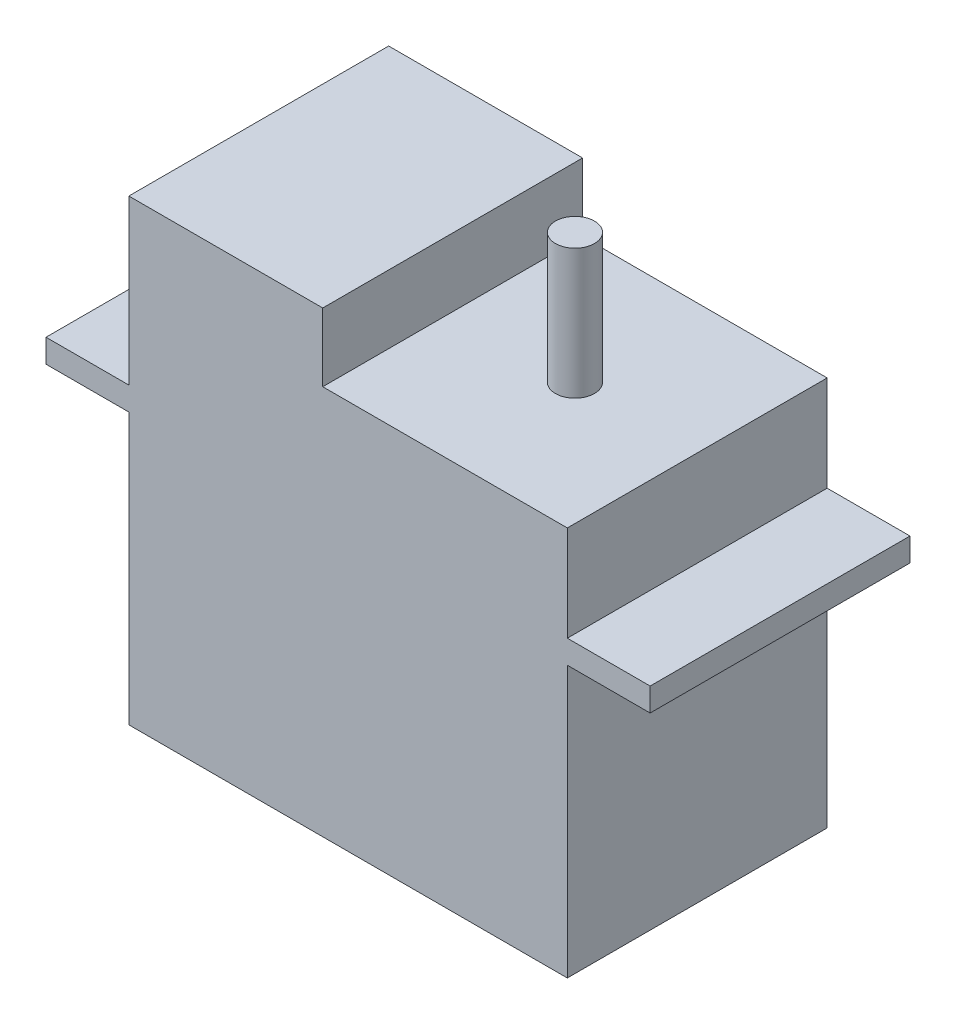
ISO-10303-21;
HEADER;
FILE_DESCRIPTION(('STEP AP214'),'2;1');
FILE_NAME('part.step','',(''),(''),'','','');
FILE_SCHEMA(('AUTOMOTIVE_DESIGN { 1 0 10303 214 1 1 1 1 }'));
ENDSEC;
DATA;
#1=APPLICATION_CONTEXT('core data for automotive mechanical design processes');
#2=APPLICATION_PROTOCOL_DEFINITION('international standard','automotive_design',2000,#1);
#3=PRODUCT_CONTEXT('',#1,'mechanical');
#4=PRODUCT('Part','Part','',(#3));
#5=PRODUCT_RELATED_PRODUCT_CATEGORY('part','',(#4));
#6=PRODUCT_DEFINITION_FORMATION('','',#4);
#7=PRODUCT_DEFINITION_CONTEXT('part definition',#1,'design');
#8=PRODUCT_DEFINITION('design','',#6,#7);
#9=PRODUCT_DEFINITION_SHAPE('','',#8);
#10=(LENGTH_UNIT() NAMED_UNIT(*) SI_UNIT(.MILLI.,.METRE.));
#11=(NAMED_UNIT(*) PLANE_ANGLE_UNIT() SI_UNIT($,.RADIAN.));
#12=(NAMED_UNIT(*) SI_UNIT($,.STERADIAN.) SOLID_ANGLE_UNIT());
#13=UNCERTAINTY_MEASURE_WITH_UNIT(LENGTH_MEASURE(1.E-05),#10,'distance_accuracy_value','');
#14=(GEOMETRIC_REPRESENTATION_CONTEXT(3) GLOBAL_UNCERTAINTY_ASSIGNED_CONTEXT((#13)) GLOBAL_UNIT_ASSIGNED_CONTEXT((#10,
#11,#12)) REPRESENTATION_CONTEXT('',''));
#15=CARTESIAN_POINT('',(0.,0.,0.));
#16=DIRECTION('',(0.,0.,1.));
#17=DIRECTION('',(1.,0.,0.));
#18=AXIS2_PLACEMENT_3D('',#15,#16,#17);
#19=CARTESIAN_POINT('',(33.75,30.,-10.));
#20=DIRECTION('',(-1.,0.,0.));
#21=DIRECTION('',(0.,-1.,0.));
#22=AXIS2_PLACEMENT_3D('',#19,#20,#21);
#23=PLANE('',#22);
#24=DIRECTION('',(0.,0.,1.));
#25=VECTOR('',#24,1.);
#26=CARTESIAN_POINT('',(33.75,30.,-10.));
#27=LINE('',#26,#25);
#28=CARTESIAN_POINT('',(33.75,30.,-10.));
#29=VERTEX_POINT('',#28);
#30=CARTESIAN_POINT('',(33.75,30.,10.));
#31=VERTEX_POINT('',#30);
#32=EDGE_CURVE('E46',#29,#31,#27,.T.);
#33=ORIENTED_EDGE('',*,*,#32,.T.);
#34=DIRECTION('',(0.,-1.,0.));
#35=VECTOR('',#34,1.);
#36=CARTESIAN_POINT('',(33.75,30.,10.));
#37=LINE('',#36,#35);
#38=CARTESIAN_POINT('',(33.75,22.65,10.));
#39=VERTEX_POINT('',#38);
#40=EDGE_CURVE('E146',#31,#39,#37,.T.);
#41=ORIENTED_EDGE('',*,*,#40,.T.);
#42=DIRECTION('',(0.,0.,1.));
#43=VECTOR('',#42,1.);
#44=CARTESIAN_POINT('',(33.75,22.65,-10.));
#45=LINE('',#44,#43);
#46=CARTESIAN_POINT('',(33.75,22.65,-10.));
#47=VERTEX_POINT('',#46);
#48=EDGE_CURVE('E11',#47,#39,#45,.T.);
#49=ORIENTED_EDGE('',*,*,#48,.F.);
#50=DIRECTION('',(0.,-1.,0.));
#51=VECTOR('',#50,1.);
#52=CARTESIAN_POINT('',(33.75,30.,-10.));
#53=LINE('',#52,#51);
#54=EDGE_CURVE('E191',#29,#47,#53,.T.);
#55=ORIENTED_EDGE('',*,*,#54,.F.);
#56=EDGE_LOOP('',(#33,#41,#49,#55));
#57=FACE_BOUND('',#56,.T.);
#58=ADVANCED_FACE('F32',(#57),#23,.F.);
#59=CARTESIAN_POINT('',(33.75,22.65,-10.));
#60=DIRECTION('',(0.,-1.,0.));
#61=DIRECTION('',(0.,0.,-1.));
#62=AXIS2_PLACEMENT_3D('',#59,#60,#61);
#63=PLANE('',#62);
#64=ORIENTED_EDGE('',*,*,#48,.T.);
#65=DIRECTION('',(1.,0.,0.));
#66=VECTOR('',#65,1.);
#67=CARTESIAN_POINT('',(33.75,22.65,10.));
#68=LINE('',#67,#66);
#69=CARTESIAN_POINT('',(40.125,22.65,10.));
#70=VERTEX_POINT('',#69);
#71=EDGE_CURVE('E136',#39,#70,#68,.T.);
#72=ORIENTED_EDGE('',*,*,#71,.T.);
#73=DIRECTION('',(0.,0.,1.));
#74=VECTOR('',#73,1.);
#75=CARTESIAN_POINT('',(40.125,22.65,-10.));
#76=LINE('',#75,#74);
#77=CARTESIAN_POINT('',(40.125,22.65,-10.));
#78=VERTEX_POINT('',#77);
#79=EDGE_CURVE('E39',#78,#70,#76,.T.);
#80=ORIENTED_EDGE('',*,*,#79,.F.);
#81=DIRECTION('',(1.,0.,0.));
#82=VECTOR('',#81,1.);
#83=CARTESIAN_POINT('',(33.75,22.65,-10.));
#84=LINE('',#83,#82);
#85=EDGE_CURVE('E137',#47,#78,#84,.T.);
#86=ORIENTED_EDGE('',*,*,#85,.F.);
#87=EDGE_LOOP('',(#64,#72,#80,#86));
#88=FACE_BOUND('',#87,.T.);
#89=ADVANCED_FACE('F134',(#88),#63,.F.);
#90=CARTESIAN_POINT('',(40.125,22.65,-10.));
#91=DIRECTION('',(-1.,0.,0.));
#92=DIRECTION('',(0.,0.,1.));
#93=AXIS2_PLACEMENT_3D('',#90,#91,#92);
#94=PLANE('',#93);
#95=ORIENTED_EDGE('',*,*,#79,.T.);
#96=DIRECTION('',(0.,-1.,0.));
#97=VECTOR('',#96,1.);
#98=CARTESIAN_POINT('',(40.125,22.65,10.));
#99=LINE('',#98,#97);
#100=CARTESIAN_POINT('',(40.125,20.85,10.));
#101=VERTEX_POINT('',#100);
#102=EDGE_CURVE('E149',#70,#101,#99,.T.);
#103=ORIENTED_EDGE('',*,*,#102,.T.);
#104=DIRECTION('',(0.,0.,1.));
#105=VECTOR('',#104,1.);
#106=CARTESIAN_POINT('',(40.125,20.85,-10.));
#107=LINE('',#106,#105);
#108=CARTESIAN_POINT('',(40.125,20.85,-10.));
#109=VERTEX_POINT('',#108);
#110=EDGE_CURVE('E242',#109,#101,#107,.T.);
#111=ORIENTED_EDGE('',*,*,#110,.F.);
#112=DIRECTION('',(0.,-1.,0.));
#113=VECTOR('',#112,1.);
#114=CARTESIAN_POINT('',(40.125,22.65,-10.));
#115=LINE('',#114,#113);
#116=EDGE_CURVE('E194',#78,#109,#115,.T.);
#117=ORIENTED_EDGE('',*,*,#116,.F.);
#118=EDGE_LOOP('',(#95,#103,#111,#117));
#119=FACE_BOUND('',#118,.T.);
#120=ADVANCED_FACE('F245',(#119),#94,.F.);
#121=CARTESIAN_POINT('',(40.125,20.85,-10.));
#122=DIRECTION('',(0.,1.,0.));
#123=DIRECTION('',(-1.,0.,0.));
#124=AXIS2_PLACEMENT_3D('',#121,#122,#123);
#125=PLANE('',#124);
#126=ORIENTED_EDGE('',*,*,#110,.T.);
#127=DIRECTION('',(-1.,0.,0.));
#128=VECTOR('',#127,1.);
#129=CARTESIAN_POINT('',(40.125,20.85,10.));
#130=LINE('',#129,#128);
#131=CARTESIAN_POINT('',(33.75,20.85,10.));
#132=VERTEX_POINT('',#131);
#133=EDGE_CURVE('E159',#101,#132,#130,.T.);
#134=ORIENTED_EDGE('',*,*,#133,.T.);
#135=DIRECTION('',(0.,0.,1.));
#136=VECTOR('',#135,1.);
#137=CARTESIAN_POINT('',(33.75,20.85,-10.));
#138=LINE('',#137,#136);
#139=CARTESIAN_POINT('',(33.75,20.85,-10.));
#140=VERTEX_POINT('',#139);
#141=EDGE_CURVE('E240',#140,#132,#138,.T.);
#142=ORIENTED_EDGE('',*,*,#141,.F.);
#143=DIRECTION('',(-1.,0.,0.));
#144=VECTOR('',#143,1.);
#145=CARTESIAN_POINT('',(40.125,20.85,-10.));
#146=LINE('',#145,#144);
#147=EDGE_CURVE('E196',#109,#140,#146,.T.);
#148=ORIENTED_EDGE('',*,*,#147,.F.);
#149=EDGE_LOOP('',(#126,#134,#142,#148));
#150=FACE_BOUND('',#149,.T.);
#151=ADVANCED_FACE('F291',(#150),#125,.F.);
#152=CARTESIAN_POINT('',(33.75,20.85,-10.));
#153=DIRECTION('',(-1.,0.,0.));
#154=DIRECTION('',(0.,-1.,0.));
#155=AXIS2_PLACEMENT_3D('',#152,#153,#154);
#156=PLANE('',#155);
#157=ORIENTED_EDGE('',*,*,#141,.T.);
#158=DIRECTION('',(0.,-1.,0.));
#159=VECTOR('',#158,1.);
#160=CARTESIAN_POINT('',(33.75,20.85,10.));
#161=LINE('',#160,#159);
#162=CARTESIAN_POINT('',(33.75,0.,10.));
#163=VERTEX_POINT('',#162);
#164=EDGE_CURVE('E162',#132,#163,#161,.T.);
#165=ORIENTED_EDGE('',*,*,#164,.T.);
#166=DIRECTION('',(0.,0.,1.));
#167=VECTOR('',#166,1.);
#168=CARTESIAN_POINT('',(33.75,0.,-10.));
#169=LINE('',#168,#167);
#170=CARTESIAN_POINT('',(33.75,0.,-10.));
#171=VERTEX_POINT('',#170);
#172=EDGE_CURVE('E238',#171,#163,#169,.T.);
#173=ORIENTED_EDGE('',*,*,#172,.F.);
#174=DIRECTION('',(0.,-1.,0.));
#175=VECTOR('',#174,1.);
#176=CARTESIAN_POINT('',(33.75,20.85,-10.));
#177=LINE('',#176,#175);
#178=EDGE_CURVE('E198',#140,#171,#177,.T.);
#179=ORIENTED_EDGE('',*,*,#178,.F.);
#180=EDGE_LOOP('',(#157,#165,#173,#179));
#181=FACE_BOUND('',#180,.T.);
#182=ADVANCED_FACE('F289',(#181),#156,.F.);
#183=CARTESIAN_POINT('',(0.,0.,-10.));
#184=DIRECTION('',(0.,-1.,0.));
#185=DIRECTION('',(0.,0.,-1.));
#186=AXIS2_PLACEMENT_3D('',#183,#184,#185);
#187=PLANE('',#186);
#188=ORIENTED_EDGE('',*,*,#172,.T.);
#189=DIRECTION('',(1.,0.,0.));
#190=VECTOR('',#189,1.);
#191=CARTESIAN_POINT('',(0.,0.,10.));
#192=LINE('',#191,#190);
#193=CARTESIAN_POINT('',(0.,0.,10.));
#194=VERTEX_POINT('',#193);
#195=EDGE_CURVE('E165',#194,#163,#192,.T.);
#196=ORIENTED_EDGE('',*,*,#195,.F.);
#197=DIRECTION('',(0.,0.,1.));
#198=VECTOR('',#197,1.);
#199=CARTESIAN_POINT('',(0.,0.,-10.));
#200=LINE('',#199,#198);
#201=CARTESIAN_POINT('',(0.,0.,-10.));
#202=VERTEX_POINT('',#201);
#203=EDGE_CURVE('E236',#202,#194,#200,.T.);
#204=ORIENTED_EDGE('',*,*,#203,.F.);
#205=DIRECTION('',(1.,0.,0.));
#206=VECTOR('',#205,1.);
#207=CARTESIAN_POINT('',(0.,0.,-10.));
#208=LINE('',#207,#206);
#209=EDGE_CURVE('E200',#202,#171,#208,.T.);
#210=ORIENTED_EDGE('',*,*,#209,.T.);
#211=EDGE_LOOP('',(#188,#196,#204,#210));
#212=FACE_BOUND('',#211,.T.);
#213=ADVANCED_FACE('F284',(#212),#187,.T.);
#214=CARTESIAN_POINT('',(0.,20.85,-10.));
#215=DIRECTION('',(-1.,0.,0.));
#216=DIRECTION('',(0.,-1.,0.));
#217=AXIS2_PLACEMENT_3D('',#214,#215,#216);
#218=PLANE('',#217);
#219=ORIENTED_EDGE('',*,*,#203,.T.);
#220=DIRECTION('',(0.,-1.,0.));
#221=VECTOR('',#220,1.);
#222=CARTESIAN_POINT('',(0.,20.85,10.));
#223=LINE('',#222,#221);
#224=CARTESIAN_POINT('',(0.,20.85,10.));
#225=VERTEX_POINT('',#224);
#226=EDGE_CURVE('E168',#225,#194,#223,.T.);
#227=ORIENTED_EDGE('',*,*,#226,.F.);
#228=DIRECTION('',(0.,0.,1.));
#229=VECTOR('',#228,1.);
#230=CARTESIAN_POINT('',(0.,20.85,-10.));
#231=LINE('',#230,#229);
#232=CARTESIAN_POINT('',(0.,20.85,-10.));
#233=VERTEX_POINT('',#232);
#234=EDGE_CURVE('E234',#233,#225,#231,.T.);
#235=ORIENTED_EDGE('',*,*,#234,.F.);
#236=DIRECTION('',(0.,-1.,0.));
#237=VECTOR('',#236,1.);
#238=CARTESIAN_POINT('',(0.,20.85,-10.));
#239=LINE('',#238,#237);
#240=EDGE_CURVE('E203',#233,#202,#239,.T.);
#241=ORIENTED_EDGE('',*,*,#240,.T.);
#242=EDGE_LOOP('',(#219,#227,#235,#241));
#243=FACE_BOUND('',#242,.T.);
#244=ADVANCED_FACE('F280',(#243),#218,.T.);
#245=CARTESIAN_POINT('',(0.,20.85,-10.));
#246=DIRECTION('',(0.,1.,0.));
#247=DIRECTION('',(-1.,0.,0.));
#248=AXIS2_PLACEMENT_3D('',#245,#246,#247);
#249=PLANE('',#248);
#250=ORIENTED_EDGE('',*,*,#234,.T.);
#251=DIRECTION('',(-1.,0.,0.));
#252=VECTOR('',#251,1.);
#253=CARTESIAN_POINT('',(0.,20.85,10.));
#254=LINE('',#253,#252);
#255=CARTESIAN_POINT('',(-6.375,20.85,10.));
#256=VERTEX_POINT('',#255);
#257=EDGE_CURVE('E171',#225,#256,#254,.T.);
#258=ORIENTED_EDGE('',*,*,#257,.T.);
#259=DIRECTION('',(0.,0.,1.));
#260=VECTOR('',#259,1.);
#261=CARTESIAN_POINT('',(-6.375,20.85,-10.));
#262=LINE('',#261,#260);
#263=CARTESIAN_POINT('',(-6.375,20.85,-10.));
#264=VERTEX_POINT('',#263);
#265=EDGE_CURVE('E232',#264,#256,#262,.T.);
#266=ORIENTED_EDGE('',*,*,#265,.F.);
#267=DIRECTION('',(-1.,0.,0.));
#268=VECTOR('',#267,1.);
#269=CARTESIAN_POINT('',(0.,20.85,-10.));
#270=LINE('',#269,#268);
#271=EDGE_CURVE('E206',#233,#264,#270,.T.);
#272=ORIENTED_EDGE('',*,*,#271,.F.);
#273=EDGE_LOOP('',(#250,#258,#266,#272));
#274=FACE_BOUND('',#273,.T.);
#275=ADVANCED_FACE('F275',(#274),#249,.F.);
#276=CARTESIAN_POINT('',(-6.375,20.85,-10.));
#277=DIRECTION('',(1.,0.,0.));
#278=DIRECTION('',(0.,1.,0.));
#279=AXIS2_PLACEMENT_3D('',#276,#277,#278);
#280=PLANE('',#279);
#281=ORIENTED_EDGE('',*,*,#265,.T.);
#282=DIRECTION('',(0.,1.,0.));
#283=VECTOR('',#282,1.);
#284=CARTESIAN_POINT('',(-6.375,20.85,10.));
#285=LINE('',#284,#283);
#286=CARTESIAN_POINT('',(-6.375,22.65,10.));
#287=VERTEX_POINT('',#286);
#288=EDGE_CURVE('E174',#256,#287,#285,.T.);
#289=ORIENTED_EDGE('',*,*,#288,.T.);
#290=DIRECTION('',(0.,0.,1.));
#291=VECTOR('',#290,1.);
#292=CARTESIAN_POINT('',(-6.375,22.65,-10.));
#293=LINE('',#292,#291);
#294=CARTESIAN_POINT('',(-6.375,22.65,-10.));
#295=VERTEX_POINT('',#294);
#296=EDGE_CURVE('E230',#295,#287,#293,.T.);
#297=ORIENTED_EDGE('',*,*,#296,.F.);
#298=DIRECTION('',(0.,1.,0.));
#299=VECTOR('',#298,1.);
#300=CARTESIAN_POINT('',(-6.375,20.85,-10.));
#301=LINE('',#300,#299);
#302=EDGE_CURVE('E208',#264,#295,#301,.T.);
#303=ORIENTED_EDGE('',*,*,#302,.F.);
#304=EDGE_LOOP('',(#281,#289,#297,#303));
#305=FACE_BOUND('',#304,.T.);
#306=ADVANCED_FACE('F271',(#305),#280,.F.);
#307=CARTESIAN_POINT('',(-6.375,22.65,-10.));
#308=DIRECTION('',(0.,-1.,0.));
#309=DIRECTION('',(0.,0.,-1.));
#310=AXIS2_PLACEMENT_3D('',#307,#308,#309);
#311=PLANE('',#310);
#312=ORIENTED_EDGE('',*,*,#296,.T.);
#313=DIRECTION('',(1.,0.,0.));
#314=VECTOR('',#313,1.);
#315=CARTESIAN_POINT('',(-6.375,22.65,10.));
#316=LINE('',#315,#314);
#317=CARTESIAN_POINT('',(0.,22.65,10.));
#318=VERTEX_POINT('',#317);
#319=EDGE_CURVE('E177',#287,#318,#316,.T.);
#320=ORIENTED_EDGE('',*,*,#319,.T.);
#321=DIRECTION('',(0.,0.,1.));
#322=VECTOR('',#321,1.);
#323=CARTESIAN_POINT('',(0.,22.65,-10.));
#324=LINE('',#323,#322);
#325=CARTESIAN_POINT('',(0.,22.65,-10.));
#326=VERTEX_POINT('',#325);
#327=EDGE_CURVE('E228',#326,#318,#324,.T.);
#328=ORIENTED_EDGE('',*,*,#327,.F.);
#329=DIRECTION('',(1.,0.,0.));
#330=VECTOR('',#329,1.);
#331=CARTESIAN_POINT('',(-6.375,22.65,-10.));
#332=LINE('',#331,#330);
#333=EDGE_CURVE('E210',#295,#326,#332,.T.);
#334=ORIENTED_EDGE('',*,*,#333,.F.);
#335=EDGE_LOOP('',(#312,#320,#328,#334));
#336=FACE_BOUND('',#335,.T.);
#337=ADVANCED_FACE('F267',(#336),#311,.F.);
#338=CARTESIAN_POINT('',(0.,35.25,-10.));
#339=DIRECTION('',(-1.,0.,0.));
#340=DIRECTION('',(0.,-1.,0.));
#341=AXIS2_PLACEMENT_3D('',#338,#339,#340);
#342=PLANE('',#341);
#343=ORIENTED_EDGE('',*,*,#327,.T.);
#344=DIRECTION('',(0.,-1.,0.));
#345=VECTOR('',#344,1.);
#346=CARTESIAN_POINT('',(0.,35.25,10.));
#347=LINE('',#346,#345);
#348=CARTESIAN_POINT('',(0.,35.25,10.));
#349=VERTEX_POINT('',#348);
#350=EDGE_CURVE('E180',#349,#318,#347,.T.);
#351=ORIENTED_EDGE('',*,*,#350,.F.);
#352=DIRECTION('',(0.,0.,1.));
#353=VECTOR('',#352,1.);
#354=CARTESIAN_POINT('',(0.,35.25,-10.));
#355=LINE('',#354,#353);
#356=CARTESIAN_POINT('',(0.,35.25,-10.));
#357=VERTEX_POINT('',#356);
#358=EDGE_CURVE('E226',#357,#349,#355,.T.);
#359=ORIENTED_EDGE('',*,*,#358,.F.);
#360=DIRECTION('',(0.,-1.,0.));
#361=VECTOR('',#360,1.);
#362=CARTESIAN_POINT('',(0.,35.25,-10.));
#363=LINE('',#362,#361);
#364=EDGE_CURVE('E212',#357,#326,#363,.T.);
#365=ORIENTED_EDGE('',*,*,#364,.T.);
#366=EDGE_LOOP('',(#343,#351,#359,#365));
#367=FACE_BOUND('',#366,.T.);
#368=ADVANCED_FACE('F262',(#367),#342,.T.);
#369=CARTESIAN_POINT('',(14.925,35.25,-10.));
#370=DIRECTION('',(0.,1.,0.));
#371=DIRECTION('',(-1.,0.,0.));
#372=AXIS2_PLACEMENT_3D('',#369,#370,#371);
#373=PLANE('',#372);
#374=ORIENTED_EDGE('',*,*,#358,.T.);
#375=DIRECTION('',(-1.,0.,0.));
#376=VECTOR('',#375,1.);
#377=CARTESIAN_POINT('',(14.925,35.25,10.));
#378=LINE('',#377,#376);
#379=CARTESIAN_POINT('',(14.925,35.25,10.));
#380=VERTEX_POINT('',#379);
#381=EDGE_CURVE('E183',#380,#349,#378,.T.);
#382=ORIENTED_EDGE('',*,*,#381,.F.);
#383=DIRECTION('',(0.,0.,1.));
#384=VECTOR('',#383,1.);
#385=CARTESIAN_POINT('',(14.925,35.25,-10.));
#386=LINE('',#385,#384);
#387=CARTESIAN_POINT('',(14.925,35.25,-10.));
#388=VERTEX_POINT('',#387);
#389=EDGE_CURVE('E224',#388,#380,#386,.T.);
#390=ORIENTED_EDGE('',*,*,#389,.F.);
#391=DIRECTION('',(-1.,0.,0.));
#392=VECTOR('',#391,1.);
#393=CARTESIAN_POINT('',(14.925,35.25,-10.));
#394=LINE('',#393,#392);
#395=EDGE_CURVE('E215',#388,#357,#394,.T.);
#396=ORIENTED_EDGE('',*,*,#395,.T.);
#397=EDGE_LOOP('',(#374,#382,#390,#396));
#398=FACE_BOUND('',#397,.T.);
#399=ADVANCED_FACE('F257',(#398),#373,.T.);
#400=CARTESIAN_POINT('',(14.925,30.,-10.));
#401=DIRECTION('',(1.,0.,0.));
#402=DIRECTION('',(0.,1.,0.));
#403=AXIS2_PLACEMENT_3D('',#400,#401,#402);
#404=PLANE('',#403);
#405=ORIENTED_EDGE('',*,*,#389,.T.);
#406=DIRECTION('',(0.,1.,0.));
#407=VECTOR('',#406,1.);
#408=CARTESIAN_POINT('',(14.925,30.,10.));
#409=LINE('',#408,#407);
#410=CARTESIAN_POINT('',(14.925,30.,10.));
#411=VERTEX_POINT('',#410);
#412=EDGE_CURVE('E186',#411,#380,#409,.T.);
#413=ORIENTED_EDGE('',*,*,#412,.F.);
#414=DIRECTION('',(0.,0.,1.));
#415=VECTOR('',#414,1.);
#416=CARTESIAN_POINT('',(14.925,30.,-10.));
#417=LINE('',#416,#415);
#418=CARTESIAN_POINT('',(14.925,30.,-10.));
#419=VERTEX_POINT('',#418);
#420=EDGE_CURVE('E54',#419,#411,#417,.T.);
#421=ORIENTED_EDGE('',*,*,#420,.F.);
#422=DIRECTION('',(0.,1.,0.));
#423=VECTOR('',#422,1.);
#424=CARTESIAN_POINT('',(14.925,30.,-10.));
#425=LINE('',#424,#423);
#426=EDGE_CURVE('E218',#419,#388,#425,.T.);
#427=ORIENTED_EDGE('',*,*,#426,.T.);
#428=EDGE_LOOP('',(#405,#413,#421,#427));
#429=FACE_BOUND('',#428,.T.);
#430=ADVANCED_FACE('F255',(#429),#404,.T.);
#431=CARTESIAN_POINT('',(33.75,30.,-10.));
#432=DIRECTION('',(0.,1.,0.));
#433=DIRECTION('',(-1.,0.,0.));
#434=AXIS2_PLACEMENT_3D('',#431,#432,#433);
#435=PLANE('',#434);
#436=CARTESIAN_POINT('',(24.3375,30.,0.));
#437=DIRECTION('',(0.,1.,0.));
#438=DIRECTION('',(0.,0.,1.));
#439=AXIS2_PLACEMENT_3D('',#436,#437,#438);
#440=CIRCLE('',#439,1.5);
#441=CARTESIAN_POINT('',(24.3375,30.,1.5));
#442=VERTEX_POINT('',#441);
#443=EDGE_CURVE('E154',#442,#442,#440,.T.);
#444=ORIENTED_EDGE('',*,*,#443,.F.);
#445=EDGE_LOOP('',(#444));
#446=FACE_BOUND('',#445,.T.);
#447=ORIENTED_EDGE('',*,*,#420,.T.);
#448=DIRECTION('',(-1.,0.,0.));
#449=VECTOR('',#448,1.);
#450=CARTESIAN_POINT('',(33.75,30.,10.));
#451=LINE('',#450,#449);
#452=EDGE_CURVE('E189',#31,#411,#451,.T.);
#453=ORIENTED_EDGE('',*,*,#452,.F.);
#454=ORIENTED_EDGE('',*,*,#32,.F.);
#455=DIRECTION('',(-1.,0.,0.));
#456=VECTOR('',#455,1.);
#457=CARTESIAN_POINT('',(33.75,30.,-10.));
#458=LINE('',#457,#456);
#459=EDGE_CURVE('E220',#29,#419,#458,.T.);
#460=ORIENTED_EDGE('',*,*,#459,.T.);
#461=EDGE_LOOP('',(#447,#453,#454,#460));
#462=FACE_BOUND('',#461,.T.);
#463=ADVANCED_FACE('F253',(#446,#462),#435,.T.);
#464=CARTESIAN_POINT('',(0.,0.,-10.));
#465=DIRECTION('',(0.,0.,1.));
#466=DIRECTION('',(1.,0.,0.));
#467=AXIS2_PLACEMENT_3D('',#464,#465,#466);
#468=PLANE('',#467);
#469=ORIENTED_EDGE('',*,*,#54,.T.);
#470=ORIENTED_EDGE('',*,*,#85,.T.);
#471=ORIENTED_EDGE('',*,*,#116,.T.);
#472=ORIENTED_EDGE('',*,*,#147,.T.);
#473=ORIENTED_EDGE('',*,*,#178,.T.);
#474=ORIENTED_EDGE('',*,*,#209,.F.);
#475=ORIENTED_EDGE('',*,*,#240,.F.);
#476=ORIENTED_EDGE('',*,*,#271,.T.);
#477=ORIENTED_EDGE('',*,*,#302,.T.);
#478=ORIENTED_EDGE('',*,*,#333,.T.);
#479=ORIENTED_EDGE('',*,*,#364,.F.);
#480=ORIENTED_EDGE('',*,*,#395,.F.);
#481=ORIENTED_EDGE('',*,*,#426,.F.);
#482=ORIENTED_EDGE('',*,*,#459,.F.);
#483=EDGE_LOOP('',(#469,#470,#471,#472,#473,#474,#475,#476,#477,#478,#479,#480,#481,#482));
#484=FACE_BOUND('',#483,.T.);
#485=ADVANCED_FACE('F249',(#484),#468,.F.);
#486=CARTESIAN_POINT('',(0.,0.,10.));
#487=DIRECTION('',(0.,0.,1.));
#488=DIRECTION('',(1.,0.,0.));
#489=AXIS2_PLACEMENT_3D('',#486,#487,#488);
#490=PLANE('',#489);
#491=ORIENTED_EDGE('',*,*,#40,.F.);
#492=ORIENTED_EDGE('',*,*,#452,.T.);
#493=ORIENTED_EDGE('',*,*,#412,.T.);
#494=ORIENTED_EDGE('',*,*,#381,.T.);
#495=ORIENTED_EDGE('',*,*,#350,.T.);
#496=ORIENTED_EDGE('',*,*,#319,.F.);
#497=ORIENTED_EDGE('',*,*,#288,.F.);
#498=ORIENTED_EDGE('',*,*,#257,.F.);
#499=ORIENTED_EDGE('',*,*,#226,.T.);
#500=ORIENTED_EDGE('',*,*,#195,.T.);
#501=ORIENTED_EDGE('',*,*,#164,.F.);
#502=ORIENTED_EDGE('',*,*,#133,.F.);
#503=ORIENTED_EDGE('',*,*,#102,.F.);
#504=ORIENTED_EDGE('',*,*,#71,.F.);
#505=EDGE_LOOP('',(#491,#492,#493,#494,#495,#496,#497,#498,#499,#500,#501,#502,#503,#504));
#506=FACE_BOUND('',#505,.T.);
#507=ADVANCED_FACE('F144',(#506),#490,.T.);
#508=CARTESIAN_POINT('',(24.3375,40.,0.));
#509=DIRECTION('',(0.,-1.,0.));
#510=DIRECTION('',(0.,0.,-1.));
#511=AXIS2_PLACEMENT_3D('',#508,#509,#510);
#512=CYLINDRICAL_SURFACE('',#511,1.5);
#513=CARTESIAN_POINT('',(24.3375,40.,0.));
#514=DIRECTION('',(0.,1.,0.));
#515=DIRECTION('',(0.,0.,1.));
#516=AXIS2_PLACEMENT_3D('',#513,#514,#515);
#517=CIRCLE('',#516,1.5);
#518=CARTESIAN_POINT('',(24.3375,40.,1.5));
#519=VERTEX_POINT('',#518);
#520=EDGE_CURVE('E151',#519,#519,#517,.T.);
#521=ORIENTED_EDGE('',*,*,#520,.F.);
#522=EDGE_LOOP('',(#521));
#523=FACE_BOUND('',#522,.T.);
#524=ORIENTED_EDGE('',*,*,#443,.T.);
#525=EDGE_LOOP('',(#524));
#526=FACE_BOUND('',#525,.T.);
#527=ADVANCED_FACE('F403',(#523,#526),#512,.T.);
#528=CARTESIAN_POINT('',(24.3375,40.,0.));
#529=DIRECTION('',(0.,1.,0.));
#530=DIRECTION('',(0.,0.,1.));
#531=AXIS2_PLACEMENT_3D('',#528,#529,#530);
#532=PLANE('',#531);
#533=ORIENTED_EDGE('',*,*,#520,.T.);
#534=EDGE_LOOP('',(#533));
#535=FACE_BOUND('',#534,.T.);
#536=ADVANCED_FACE('F419',(#535),#532,.T.);
#537=CLOSED_SHELL('',(#58,#89,#120,#151,#182,#213,#244,#275,#306,#337,#368,#399,#430,#463,#485,
#507,#527,#536));
#538=MANIFOLD_SOLID_BREP('B2',#537);
#539=ADVANCED_BREP_SHAPE_REPRESENTATION('',(#18,#538),#14);
#540=SHAPE_DEFINITION_REPRESENTATION(#9,#539);
ENDSEC;
END-ISO-10303-21;
